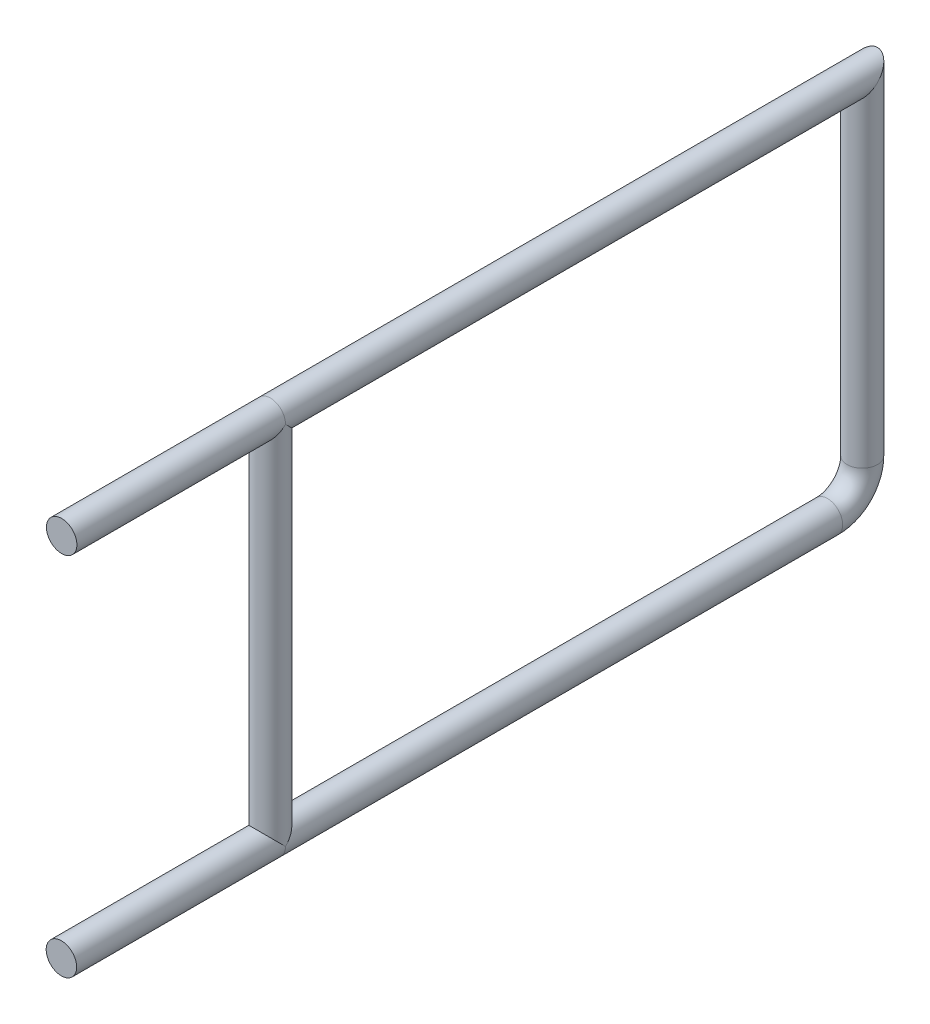
ISO-10303-21;
HEADER;
FILE_DESCRIPTION(('STEP AP214'),'2;1');
FILE_NAME('part.step','',(''),(''),'','','');
FILE_SCHEMA(('AUTOMOTIVE_DESIGN { 1 0 10303 214 1 1 1 1 }'));
ENDSEC;
DATA;
#1=APPLICATION_CONTEXT('core data for automotive mechanical design processes');
#2=APPLICATION_PROTOCOL_DEFINITION('international standard','automotive_design',2000,#1);
#3=PRODUCT_CONTEXT('',#1,'mechanical');
#4=PRODUCT('Part','Part','',(#3));
#5=PRODUCT_RELATED_PRODUCT_CATEGORY('part','',(#4));
#6=PRODUCT_DEFINITION_FORMATION('','',#4);
#7=PRODUCT_DEFINITION_CONTEXT('part definition',#1,'design');
#8=PRODUCT_DEFINITION('design','',#6,#7);
#9=PRODUCT_DEFINITION_SHAPE('','',#8);
#10=(LENGTH_UNIT() NAMED_UNIT(*) SI_UNIT(.MILLI.,.METRE.));
#11=(NAMED_UNIT(*) PLANE_ANGLE_UNIT() SI_UNIT($,.RADIAN.));
#12=(NAMED_UNIT(*) SI_UNIT($,.STERADIAN.) SOLID_ANGLE_UNIT());
#13=UNCERTAINTY_MEASURE_WITH_UNIT(LENGTH_MEASURE(1.E-05),#10,'distance_accuracy_value','');
#14=(GEOMETRIC_REPRESENTATION_CONTEXT(3) GLOBAL_UNCERTAINTY_ASSIGNED_CONTEXT((#13)) GLOBAL_UNIT_ASSIGNED_CONTEXT((#10,
#11,#12)) REPRESENTATION_CONTEXT('',''));
#15=CARTESIAN_POINT('',(0.,0.,0.));
#16=DIRECTION('',(0.,0.,1.));
#17=DIRECTION('',(1.,0.,0.));
#18=AXIS2_PLACEMENT_3D('',#15,#16,#17);
#19=CARTESIAN_POINT('',(0.,-698.5,0.18722046084918));
#20=DIRECTION('',(0.,0.,1.));
#21=DIRECTION('',(1.,0.,0.));
#22=AXIS2_PLACEMENT_3D('',#19,#20,#21);
#23=PLANE('',#22);
#24=CARTESIAN_POINT('',(0.,-698.5,0.18722046084918));
#25=DIRECTION('',(0.,0.,1.));
#26=DIRECTION('',(1.,0.,0.));
#27=AXIS2_PLACEMENT_3D('',#24,#25,#26);
#28=CIRCLE('',#27,11.1125);
#29=CARTESIAN_POINT('',(11.1125,-698.5,0.18722046084918));
#30=VERTEX_POINT('',#29);
#31=EDGE_CURVE('E97',#30,#30,#28,.T.);
#32=ORIENTED_EDGE('',*,*,#31,.T.);
#33=EDGE_LOOP('',(#32));
#34=FACE_BOUND('',#33,.T.);
#35=ADVANCED_FACE('F46',(#34),#23,.T.);
#36=CARTESIAN_POINT('',(0.,-431.8,0.));
#37=DIRECTION('',(0.,0.,-1.));
#38=DIRECTION('',(1.,0.,0.));
#39=AXIS2_PLACEMENT_3D('',#36,#37,#38);
#40=PLANE('',#39);
#41=CARTESIAN_POINT('',(0.,-431.8,0.));
#42=DIRECTION('',(0.,0.,-1.));
#43=DIRECTION('',(1.,0.,0.));
#44=AXIS2_PLACEMENT_3D('',#41,#42,#43);
#45=CIRCLE('',#44,11.1125);
#46=CARTESIAN_POINT('',(11.1125,-431.8,0.));
#47=VERTEX_POINT('',#46);
#48=EDGE_CURVE('E53',#47,#47,#45,.T.);
#49=ORIENTED_EDGE('',*,*,#48,.F.);
#50=EDGE_LOOP('',(#49));
#51=FACE_BOUND('',#50,.T.);
#52=ADVANCED_FACE('F117',(#51),#40,.F.);
#53=CARTESIAN_POINT('',(0.,-407.2525,-584.012779539151));
#54=DIRECTION('',(0.,-1.,0.));
#55=DIRECTION('',(0.,0.,-1.));
#56=AXIS2_PLACEMENT_3D('',#53,#54,#55);
#57=CYLINDRICAL_SURFACE('',#56,11.1125);
#58=CARTESIAN_POINT('',(0.,-431.8,-584.012779539151));
#59=DIRECTION('',(0.,-0.707106781186548,-0.707106781186548));
#60=DIRECTION('',(0.,0.707106781186548,-0.707106781186548));
#61=AXIS2_PLACEMENT_3D('',#58,#59,#60);
#62=ELLIPSE('',#61,15.715448211871,11.1125);
#63=CARTESIAN_POINT('',(0.,-420.6875,-595.125279539151));
#64=VERTEX_POINT('',#63);
#65=EDGE_CURVE('E81',#64,#64,#62,.F.);
#66=ORIENTED_EDGE('',*,*,#65,.F.);
#67=EDGE_LOOP('',(#66));
#68=FACE_BOUND('',#67,.T.);
#69=CARTESIAN_POINT('',(0.,-673.1,-584.012779539151));
#70=DIRECTION('',(0.,-1.,0.));
#71=DIRECTION('',(1.,0.,0.));
#72=AXIS2_PLACEMENT_3D('',#69,#70,#71);
#73=CIRCLE('',#72,11.1125);
#74=CARTESIAN_POINT('',(0.,-673.1,-595.125279539151));
#75=VERTEX_POINT('',#74);
#76=EDGE_CURVE('E103',#75,#75,#73,.T.);
#77=ORIENTED_EDGE('',*,*,#76,.F.);
#78=EDGE_LOOP('',(#77));
#79=FACE_BOUND('',#78,.T.);
#80=ADVANCED_FACE('F115',(#68,#79),#57,.T.);
#81=CARTESIAN_POINT('',(0.,-673.1,-558.612779539151));
#82=DIRECTION('',(-1.,0.,0.));
#83=DIRECTION('',(0.,0.,1.));
#84=AXIS2_PLACEMENT_3D('',#81,#82,#83);
#85=TOROIDAL_SURFACE('',#84,25.4,11.1125);
#86=CARTESIAN_POINT('',(0.,-698.5,-558.612779539157));
#87=DIRECTION('',(0.,0.,1.));
#88=DIRECTION('',(1.,0.,0.));
#89=AXIS2_PLACEMENT_3D('',#86,#87,#88);
#90=CIRCLE('',#89,11.1125);
#91=CARTESIAN_POINT('',(0.,-709.6125,-558.612779539159));
#92=VERTEX_POINT('',#91);
#93=EDGE_CURVE('E108',#92,#92,#90,.T.);
#94=CARTESIAN_POINT('',(0.,-673.1,-558.612779539151));
#95=DIRECTION('',(-1.,0.,0.));
#96=DIRECTION('',(0.,0.,1.));
#97=AXIS2_PLACEMENT_3D('',#94,#95,#96);
#98=CIRCLE('',#97,36.5125);
#99=EDGE_CURVE('',#75,#92,#98,.T.);
#100=ORIENTED_EDGE('',*,*,#76,.T.);
#101=ORIENTED_EDGE('',*,*,#93,.F.);
#102=ORIENTED_EDGE('',*,*,#99,.T.);
#103=ORIENTED_EDGE('',*,*,#99,.F.);
#104=EDGE_LOOP('',(#100,#102,#101,#103));
#105=FACE_BOUND('',#104,.T.);
#106=ADVANCED_FACE('F113',(#105),#85,.T.);
#107=CARTESIAN_POINT('',(0.,-698.5,-558.612779539151));
#108=DIRECTION('',(0.,0.,1.));
#109=DIRECTION('',(1.,0.,0.));
#110=AXIS2_PLACEMENT_3D('',#107,#108,#109);
#111=CYLINDRICAL_SURFACE('',#110,11.1125);
#112=CARTESIAN_POINT('',(0.,-698.5,-152.212779539151));
#113=DIRECTION('',(0.,0.,1.));
#114=DIRECTION('',(1.,0.,0.));
#115=AXIS2_PLACEMENT_3D('',#112,#113,#114);
#116=CIRCLE('',#115,11.1125);
#117=CARTESIAN_POINT('',(-11.1125,-698.5,-152.212779539151));
#118=VERTEX_POINT('',#117);
#119=CARTESIAN_POINT('',(11.1125,-698.5,-152.212779539151));
#120=VERTEX_POINT('',#119);
#121=EDGE_CURVE('E106',#118,#120,#116,.T.);
#122=ORIENTED_EDGE('',*,*,#121,.F.);
#123=CARTESIAN_POINT('',(0.,-698.5,-152.212779539151));
#124=DIRECTION('',(0.,0.707106781186547,0.707106781186547));
#125=DIRECTION('',(0.,-0.707106781186548,0.707106781186547));
#126=AXIS2_PLACEMENT_3D('',#123,#124,#125);
#127=ELLIPSE('',#126,15.715448211871,11.1125);
#128=EDGE_CURVE('E87',#120,#118,#127,.T.);
#129=ORIENTED_EDGE('',*,*,#128,.F.);
#130=EDGE_LOOP('',(#122,#129));
#131=FACE_BOUND('',#130,.T.);
#132=ORIENTED_EDGE('',*,*,#93,.T.);
#133=EDGE_LOOP('',(#132));
#134=FACE_BOUND('',#133,.T.);
#135=ADVANCED_FACE('F124',(#131,#134),#111,.T.);
#136=CARTESIAN_POINT('',(0.,-698.5,-152.212779539151));
#137=DIRECTION('',(0.,0.,1.));
#138=DIRECTION('',(1.,0.,0.));
#139=AXIS2_PLACEMENT_3D('',#136,#137,#138);
#140=CYLINDRICAL_SURFACE('',#139,11.1125);
#141=CARTESIAN_POINT('',(0.,-698.5,-152.212779539151));
#142=DIRECTION('',(0.,-0.707106781186548,0.707106781186547));
#143=DIRECTION('',(0.,-0.707106781186547,-0.707106781186548));
#144=AXIS2_PLACEMENT_3D('',#141,#142,#143);
#145=ELLIPSE('',#144,15.715448211871,11.1125);
#146=EDGE_CURVE('E59',#118,#120,#145,.F.);
#147=ORIENTED_EDGE('',*,*,#146,.F.);
#148=ORIENTED_EDGE('',*,*,#121,.T.);
#149=EDGE_LOOP('',(#147,#148));
#150=FACE_BOUND('',#149,.T.);
#151=ORIENTED_EDGE('',*,*,#31,.F.);
#152=EDGE_LOOP('',(#151));
#153=FACE_BOUND('',#152,.T.);
#154=ADVANCED_FACE('F133',(#150,#153),#140,.T.);
#155=CARTESIAN_POINT('',(0.,-431.8,0.));
#156=DIRECTION('',(0.,0.,-1.));
#157=DIRECTION('',(-1.,0.,0.));
#158=AXIS2_PLACEMENT_3D('',#155,#156,#157);
#159=CYLINDRICAL_SURFACE('',#158,11.1125);
#160=CARTESIAN_POINT('',(0.,-431.8,-152.212779539151));
#161=DIRECTION('',(0.,-0.707106781186547,-0.707106781186547));
#162=DIRECTION('',(0.,0.707106781186548,-0.707106781186547));
#163=AXIS2_PLACEMENT_3D('',#160,#161,#162);
#164=ELLIPSE('',#163,15.715448211871,11.1125);
#165=CARTESIAN_POINT('',(11.1125,-431.8,-152.212779539151));
#166=VERTEX_POINT('',#165);
#167=CARTESIAN_POINT('',(-11.1125,-431.8,-152.212779539151));
#168=VERTEX_POINT('',#167);
#169=EDGE_CURVE('E83',#166,#168,#164,.T.);
#170=ORIENTED_EDGE('',*,*,#169,.F.);
#171=CARTESIAN_POINT('',(0.,-431.8,-152.212779539151));
#172=DIRECTION('',(0.,0.,-1.));
#173=DIRECTION('',(1.,0.,0.));
#174=AXIS2_PLACEMENT_3D('',#171,#172,#173);
#175=CIRCLE('',#174,11.1125);
#176=EDGE_CURVE('E75',#168,#166,#175,.T.);
#177=ORIENTED_EDGE('',*,*,#176,.F.);
#178=EDGE_LOOP('',(#170,#177));
#179=FACE_BOUND('',#178,.T.);
#180=ORIENTED_EDGE('',*,*,#48,.T.);
#181=EDGE_LOOP('',(#180));
#182=FACE_BOUND('',#181,.T.);
#183=ADVANCED_FACE('F84',(#179,#182),#159,.T.);
#184=CARTESIAN_POINT('',(0.,-431.8,-152.212779539151));
#185=DIRECTION('',(0.,0.,-1.));
#186=DIRECTION('',(-1.,0.,0.));
#187=AXIS2_PLACEMENT_3D('',#184,#185,#186);
#188=CYLINDRICAL_SURFACE('',#187,11.1125);
#189=CARTESIAN_POINT('',(0.,-431.8,-152.212779539151));
#190=DIRECTION('',(0.,0.707106781186548,-0.707106781186547));
#191=DIRECTION('',(0.,-0.707106781186547,-0.707106781186547));
#192=AXIS2_PLACEMENT_3D('',#189,#190,#191);
#193=ELLIPSE('',#192,15.715448211871,11.1125);
#194=EDGE_CURVE('E13',#168,#166,#193,.F.);
#195=ORIENTED_EDGE('',*,*,#194,.F.);
#196=ORIENTED_EDGE('',*,*,#176,.T.);
#197=EDGE_LOOP('',(#195,#196));
#198=FACE_BOUND('',#197,.T.);
#199=ORIENTED_EDGE('',*,*,#65,.T.);
#200=EDGE_LOOP('',(#199));
#201=FACE_BOUND('',#200,.T.);
#202=ADVANCED_FACE('F77',(#198,#201),#188,.T.);
#203=CARTESIAN_POINT('',(0.,-431.8,-152.212779539151));
#204=DIRECTION('',(0.,-1.,0.));
#205=DIRECTION('',(0.,0.,-1.));
#206=AXIS2_PLACEMENT_3D('',#203,#204,#205);
#207=CYLINDRICAL_SURFACE('',#206,11.1125);
#208=ORIENTED_EDGE('',*,*,#194,.T.);
#209=ORIENTED_EDGE('',*,*,#169,.T.);
#210=EDGE_LOOP('',(#208,#209));
#211=FACE_BOUND('',#210,.T.);
#212=ORIENTED_EDGE('',*,*,#146,.T.);
#213=ORIENTED_EDGE('',*,*,#128,.T.);
#214=EDGE_LOOP('',(#212,#213));
#215=FACE_BOUND('',#214,.T.);
#216=ADVANCED_FACE('F89',(#211,#215),#207,.T.);
#217=CLOSED_SHELL('',(#35,#52,#80,#106,#135,#154,#183,#202,#216));
#218=MANIFOLD_SOLID_BREP('B2',#217);
#219=ADVANCED_BREP_SHAPE_REPRESENTATION('',(#18,#218),#14);
#220=SHAPE_DEFINITION_REPRESENTATION(#9,#219);
ENDSEC;
END-ISO-10303-21;
